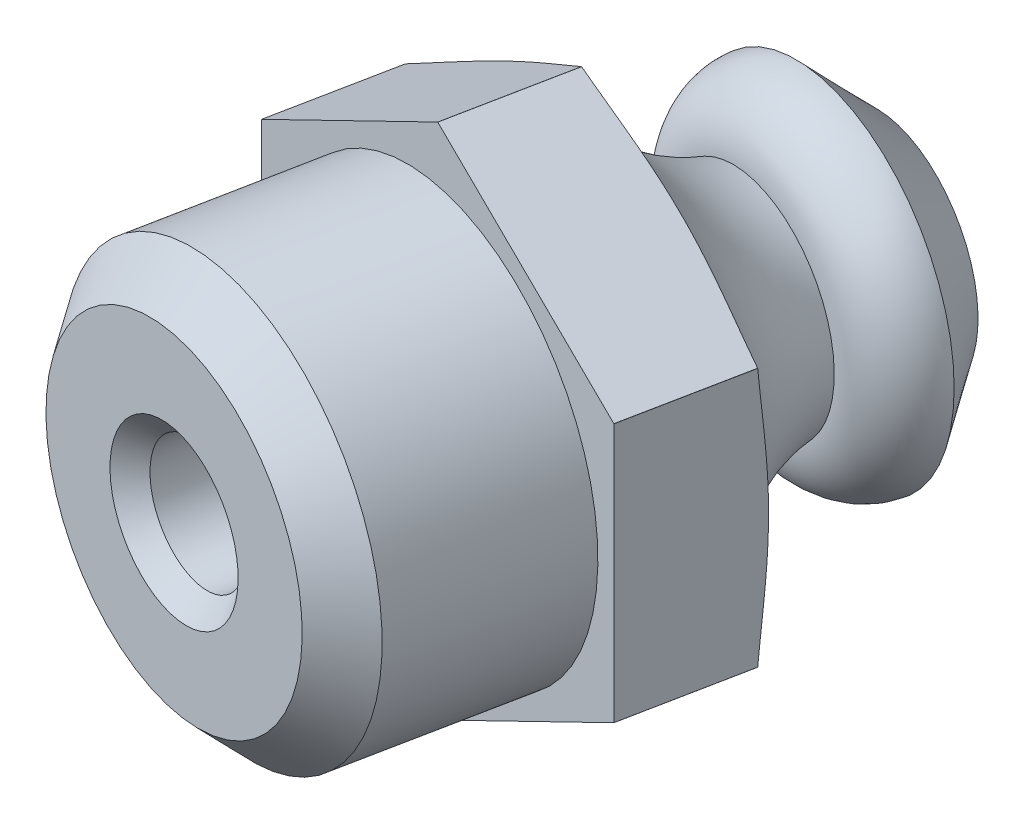
ISO-10303-21;
HEADER;
FILE_DESCRIPTION(('STEP AP214'),'2;1');
FILE_NAME('part.step','',(''),(''),'','','');
FILE_SCHEMA(('AUTOMOTIVE_DESIGN { 1 0 10303 214 1 1 1 1 }'));
ENDSEC;
DATA;
#1=APPLICATION_CONTEXT('core data for automotive mechanical design processes');
#2=APPLICATION_PROTOCOL_DEFINITION('international standard','automotive_design',2000,#1);
#3=PRODUCT_CONTEXT('',#1,'mechanical');
#4=PRODUCT('Part','Part','',(#3));
#5=PRODUCT_RELATED_PRODUCT_CATEGORY('part','',(#4));
#6=PRODUCT_DEFINITION_FORMATION('','',#4);
#7=PRODUCT_DEFINITION_CONTEXT('part definition',#1,'design');
#8=PRODUCT_DEFINITION('design','',#6,#7);
#9=PRODUCT_DEFINITION_SHAPE('','',#8);
#10=(LENGTH_UNIT() NAMED_UNIT(*) SI_UNIT(.MILLI.,.METRE.));
#11=(NAMED_UNIT(*) PLANE_ANGLE_UNIT() SI_UNIT($,.RADIAN.));
#12=(NAMED_UNIT(*) SI_UNIT($,.STERADIAN.) SOLID_ANGLE_UNIT());
#13=UNCERTAINTY_MEASURE_WITH_UNIT(LENGTH_MEASURE(1.E-05),#10,'distance_accuracy_value','');
#14=(GEOMETRIC_REPRESENTATION_CONTEXT(3) GLOBAL_UNCERTAINTY_ASSIGNED_CONTEXT((#13)) GLOBAL_UNIT_ASSIGNED_CONTEXT((#10,
#11,#12)) REPRESENTATION_CONTEXT('',''));
#15=CARTESIAN_POINT('',(0.,0.,0.));
#16=DIRECTION('',(0.,0.,1.));
#17=DIRECTION('',(1.,0.,0.));
#18=AXIS2_PLACEMENT_3D('',#15,#16,#17);
#19=CARTESIAN_POINT('',(-15.176286513132,5.,76.2963445312825));
#20=DIRECTION('',(0.195090322016136,0.,-0.980785280403229));
#21=DIRECTION('',(0.,1.,0.));
#22=AXIS2_PLACEMENT_3D('',#19,#20,#21);
#23=CONICAL_SURFACE('',#22,4.,0.785398163397446);
#24=CARTESIAN_POINT('',(-15.176286513132,5.,76.2963445312825));
#25=DIRECTION('',(-0.195090322016136,0.,0.980785280403229));
#26=DIRECTION('',(0.,1.,0.));
#27=AXIS2_PLACEMENT_3D('',#24,#25,#26);
#28=CIRCLE('',#27,4.);
#29=CARTESIAN_POINT('',(-15.176286513132,9.,76.2963445312825));
#30=VERTEX_POINT('',#29);
#31=EDGE_CURVE('E595',#30,#30,#28,.T.);
#32=ORIENTED_EDGE('',*,*,#31,.F.);
#33=EDGE_LOOP('',(#32));
#34=FACE_BOUND('',#33,.T.);
#35=CARTESIAN_POINT('',(-14.9811961911159,5.,75.3155592508793));
#36=DIRECTION('',(0.195090322016136,0.,-0.980785280403229));
#37=DIRECTION('',(0.,1.,0.));
#38=AXIS2_PLACEMENT_3D('',#35,#36,#37);
#39=CIRCLE('',#38,5.);
#40=CARTESIAN_POINT('',(-14.9811961911159,10.,75.3155592508793));
#41=VERTEX_POINT('',#40);
#42=EDGE_CURVE('E587',#41,#41,#39,.T.);
#43=ORIENTED_EDGE('',*,*,#42,.F.);
#44=EDGE_LOOP('',(#43));
#45=FACE_BOUND('',#44,.T.);
#46=ADVANCED_FACE('F17',(#34,#45),#23,.T.);
#47=CARTESIAN_POINT('',(-16.6474644337369,5.,76.0037090482583));
#48=DIRECTION('',(0.195090322016136,0.,-0.980785280403229));
#49=DIRECTION('',(0.,1.,0.));
#50=AXIS2_PLACEMENT_3D('',#47,#48,#49);
#51=PLANE('',#50);
#52=ORIENTED_EDGE('',*,*,#31,.T.);
#53=EDGE_LOOP('',(#52));
#54=FACE_BOUND('',#53,.T.);
#55=CARTESIAN_POINT('',(-15.1762865131321,5.,76.2963445312825));
#56=DIRECTION('',(0.195090322016136,0.,-0.980785280403229));
#57=DIRECTION('',(0.,1.,0.));
#58=AXIS2_PLACEMENT_3D('',#55,#56,#57);
#59=CIRCLE('',#58,1.99999999999998);
#60=CARTESIAN_POINT('',(-15.176286513132,6.99999999999998,76.2963445312825));
#61=VERTEX_POINT('',#60);
#62=EDGE_CURVE('E580',#61,#61,#59,.T.);
#63=ORIENTED_EDGE('',*,*,#62,.T.);
#64=EDGE_LOOP('',(#63));
#65=FACE_BOUND('',#64,.T.);
#66=ADVANCED_FACE('F606',(#54,#65),#51,.F.);
#67=CARTESIAN_POINT('',(-15.176286513132,5.,76.2963445312825));
#68=DIRECTION('',(-0.195090322016136,0.,0.980785280403229));
#69=DIRECTION('',(0.,-1.,0.));
#70=AXIS2_PLACEMENT_3D('',#67,#68,#69);
#71=CYLINDRICAL_SURFACE('',#70,5.);
#72=CARTESIAN_POINT('',(-14.1032897420433,5.,70.9020254890648));
#73=DIRECTION('',(-0.195090322016136,0.,0.980785280403229));
#74=DIRECTION('',(0.,-1.,0.));
#75=AXIS2_PLACEMENT_3D('',#72,#73,#74);
#76=CIRCLE('',#75,5.);
#77=CARTESIAN_POINT('',(-14.1032897420433,0.,70.9020254890648));
#78=VERTEX_POINT('',#77);
#79=EDGE_CURVE('E143',#78,#78,#76,.T.);
#80=ORIENTED_EDGE('',*,*,#79,.T.);
#81=EDGE_LOOP('',(#80));
#82=FACE_BOUND('',#81,.T.);
#83=ORIENTED_EDGE('',*,*,#42,.T.);
#84=EDGE_LOOP('',(#83));
#85=FACE_BOUND('',#84,.T.);
#86=ADVANCED_FACE('F614',(#82,#85),#71,.T.);
#87=CARTESIAN_POINT('',(-15.078741352124,5.,75.8059518910809));
#88=DIRECTION('',(-0.195090322016136,0.,0.980785280403229));
#89=DIRECTION('',(0.,-1.,0.));
#90=AXIS2_PLACEMENT_3D('',#87,#88,#89);
#91=CONICAL_SURFACE('',#90,1.5,0.78539816339745);
#92=CARTESIAN_POINT('',(-15.0787413521239,5.,75.8059518910809));
#93=DIRECTION('',(-0.195090322016136,0.,0.980785280403229));
#94=DIRECTION('',(0.,1.,0.));
#95=AXIS2_PLACEMENT_3D('',#92,#93,#94);
#96=CIRCLE('',#95,1.5);
#97=CARTESIAN_POINT('',(-15.078741352124,6.5,75.8059518910809));
#98=VERTEX_POINT('',#97);
#99=EDGE_CURVE('E136',#98,#98,#96,.T.);
#100=ORIENTED_EDGE('',*,*,#99,.F.);
#101=EDGE_LOOP('',(#100));
#102=FACE_BOUND('',#101,.T.);
#103=ORIENTED_EDGE('',*,*,#62,.F.);
#104=EDGE_LOOP('',(#103));
#105=FACE_BOUND('',#104,.T.);
#106=ADVANCED_FACE('F616',(#102,#105),#91,.F.);
#107=CARTESIAN_POINT('',(-19.0072161440594,5.,69.9265738789841));
#108=DIRECTION('',(0.195090322016136,0.,-0.980785280403229));
#109=DIRECTION('',(0.,1.,0.));
#110=AXIS2_PLACEMENT_3D('',#107,#108,#109);
#111=PLANE('',#110);
#112=ORIENTED_EDGE('',*,*,#79,.F.);
#113=EDGE_LOOP('',(#112));
#114=FACE_BOUND('',#113,.T.);
#115=DIRECTION('',(0.,-1.,0.));
#116=VECTOR('',#115,1.);
#117=CARTESIAN_POINT('',(-8.70897069982553,8.17372021451168,71.9750222601535));
#118=LINE('',#117,#116);
#119=CARTESIAN_POINT('',(-8.70897069982553,8.17372021451168,71.9750222601535));
#120=VERTEX_POINT('',#119);
#121=CARTESIAN_POINT('',(-8.70897069982553,1.82627978548834,71.9750222601535));
#122=VERTEX_POINT('',#121);
#123=EDGE_CURVE('E119',#120,#122,#118,.T.);
#124=ORIENTED_EDGE('',*,*,#123,.F.);
#125=CARTESIAN_POINT('',(-14.1032897420433,5.,70.9020254890648));
#126=DIRECTION('',(-0.195090322016136,0.,0.980785280403229));
#127=DIRECTION('',(0.849499061766574,0.499798458978219,0.168975869462794));
#128=AXIS2_PLACEMENT_3D('',#125,#126,#127);
#129=CIRCLE('',#128,6.35);
#130=CARTESIAN_POINT('',(-8.71041997654474,8.1762796135586,71.9747339810903));
#131=VERTEX_POINT('',#130);
#132=EDGE_CURVE('E107',#120,#131,#129,.T.);
#133=ORIENTED_EDGE('',*,*,#132,.T.);
#134=DIRECTION('',(0.849384968487041,-0.5,0.16895317489846));
#135=VECTOR('',#134,1.);
#136=CARTESIAN_POINT('',(-14.1018404653241,11.3499998280703,70.9023137681279));
#137=LINE('',#136,#135);
#138=CARTESIAN_POINT('',(-14.1018404653241,11.3499998280703,70.9023137681279));
#139=VERTEX_POINT('',#138);
#140=EDGE_CURVE('E118',#139,#131,#137,.T.);
#141=ORIENTED_EDGE('',*,*,#140,.F.);
#142=CARTESIAN_POINT('',(-14.1032897420433,5.,70.9020254890648));
#143=DIRECTION('',(-0.195090322016136,0.,0.980785280403229));
#144=DIRECTION('',(0.000228232554195488,0.999999972924448,4.53982776680031E-05));
#145=AXIS2_PLACEMENT_3D('',#142,#143,#144);
#146=CIRCLE('',#145,6.35);
#147=CARTESIAN_POINT('',(-14.1047390187625,11.3499998280703,70.9017372100015));
#148=VERTEX_POINT('',#147);
#149=EDGE_CURVE('E153',#139,#148,#146,.T.);
#150=ORIENTED_EDGE('',*,*,#149,.T.);
#151=DIRECTION('',(0.849384968487041,0.5,0.16895317489846));
#152=VECTOR('',#151,1.);
#153=CARTESIAN_POINT('',(-19.4961595075418,8.17627961355863,69.8293169970393));
#154=LINE('',#153,#152);
#155=CARTESIAN_POINT('',(-19.4961595075418,8.17627961355861,69.8293169970392));
#156=VERTEX_POINT('',#155);
#157=EDGE_CURVE('E159',#156,#148,#154,.T.);
#158=ORIENTED_EDGE('',*,*,#157,.F.);
#159=CARTESIAN_POINT('',(-14.1032897420433,5.,70.9020254890648));
#160=DIRECTION('',(-0.195090322016136,0.,0.980785280403229));
#161=DIRECTION('',(-0.849270829212369,0.500201513946237,-0.168930471185124));
#162=AXIS2_PLACEMENT_3D('',#159,#160,#161);
#163=CIRCLE('',#162,6.35);
#164=CARTESIAN_POINT('',(-19.4976087842611,8.17372021451168,69.829028717976));
#165=VERTEX_POINT('',#164);
#166=EDGE_CURVE('E164',#156,#165,#163,.T.);
#167=ORIENTED_EDGE('',*,*,#166,.T.);
#168=DIRECTION('',(0.,1.,0.));
#169=VECTOR('',#168,1.);
#170=CARTESIAN_POINT('',(-19.4976087842611,1.82627978548835,69.829028717976));
#171=LINE('',#170,#169);
#172=CARTESIAN_POINT('',(-19.4976087842611,1.82627978548835,69.829028717976));
#173=VERTEX_POINT('',#172);
#174=EDGE_CURVE('E170',#173,#165,#171,.T.);
#175=ORIENTED_EDGE('',*,*,#174,.F.);
#176=CARTESIAN_POINT('',(-14.1032897420433,5.,70.9020254890648));
#177=DIRECTION('',(-0.195090322016136,0.,0.980785280403229));
#178=DIRECTION('',(-0.849499061766581,-0.499798458978207,-0.168975869462796));
#179=AXIS2_PLACEMENT_3D('',#176,#177,#178);
#180=CIRCLE('',#179,6.35);
#181=CARTESIAN_POINT('',(-19.4961595075418,1.82372038644142,69.8293169970392));
#182=VERTEX_POINT('',#181);
#183=EDGE_CURVE('E175',#173,#182,#180,.T.);
#184=ORIENTED_EDGE('',*,*,#183,.T.);
#185=DIRECTION('',(-0.849384968487041,0.5,-0.168953174898458));
#186=VECTOR('',#185,1.);
#187=CARTESIAN_POINT('',(-14.1047390187625,-1.34999982807024,70.9017372100016));
#188=LINE('',#187,#186);
#189=CARTESIAN_POINT('',(-14.1047390187625,-1.34999982807024,70.9017372100015));
#190=VERTEX_POINT('',#189);
#191=EDGE_CURVE('E181',#190,#182,#188,.T.);
#192=ORIENTED_EDGE('',*,*,#191,.F.);
#193=CARTESIAN_POINT('',(-14.1032897420433,5.,70.9020254890648));
#194=DIRECTION('',(-0.195090322016136,0.,0.980785280403229));
#195=DIRECTION('',(-0.000228232554213543,-0.999999972924448,-4.53982776715945E-05));
#196=AXIS2_PLACEMENT_3D('',#193,#194,#195);
#197=CIRCLE('',#196,6.35);
#198=CARTESIAN_POINT('',(-14.1018404653241,-1.34999982807024,70.9023137681279));
#199=VERTEX_POINT('',#198);
#200=EDGE_CURVE('E186',#190,#199,#197,.T.);
#201=ORIENTED_EDGE('',*,*,#200,.T.);
#202=DIRECTION('',(-0.849384968487041,-0.499999999999999,-0.168953174898458));
#203=VECTOR('',#202,1.);
#204=CARTESIAN_POINT('',(-8.71041997654473,1.82372038644142,71.9747339810903));
#205=LINE('',#204,#203);
#206=CARTESIAN_POINT('',(-8.71041997654474,1.82372038644142,71.9747339810903));
#207=VERTEX_POINT('',#206);
#208=EDGE_CURVE('E192',#207,#199,#205,.T.);
#209=ORIENTED_EDGE('',*,*,#208,.F.);
#210=CARTESIAN_POINT('',(-14.1032897420433,5.,70.9020254890648));
#211=DIRECTION('',(-0.195090322016136,0.,0.980785280403229));
#212=DIRECTION('',(0.849270829212369,-0.500201513946236,0.168930471185125));
#213=AXIS2_PLACEMENT_3D('',#210,#211,#212);
#214=CIRCLE('',#213,6.35);
#215=EDGE_CURVE('E134',#207,#122,#214,.T.);
#216=ORIENTED_EDGE('',*,*,#215,.T.);
#217=EDGE_LOOP('',(#124,#133,#141,#150,#158,#167,#175,#184,#192,#201,#209,#216));
#218=FACE_BOUND('',#217,.T.);
#219=ADVANCED_FACE('F132',(#114,#218),#111,.F.);
#220=CARTESIAN_POINT('',(-15.176286513132,5.,76.2963445312825));
#221=DIRECTION('',(-0.195090322016136,0.,0.980785280403229));
#222=DIRECTION('',(0.,-1.,0.));
#223=AXIS2_PLACEMENT_3D('',#220,#221,#222);
#224=CYLINDRICAL_SURFACE('',#223,1.5);
#225=CARTESIAN_POINT('',(-12.24993168289,5.,61.5845653252341));
#226=DIRECTION('',(-0.195090322016136,0.,0.980785280403229));
#227=DIRECTION('',(0.,-1.,0.));
#228=AXIS2_PLACEMENT_3D('',#225,#226,#227);
#229=CIRCLE('',#228,1.5);
#230=CARTESIAN_POINT('',(-12.24993168289,3.5,61.5845653252341));
#231=VERTEX_POINT('',#230);
#232=EDGE_CURVE('E201',#231,#231,#229,.T.);
#233=ORIENTED_EDGE('',*,*,#232,.F.);
#234=EDGE_LOOP('',(#233));
#235=FACE_BOUND('',#234,.T.);
#236=ORIENTED_EDGE('',*,*,#99,.T.);
#237=EDGE_LOOP('',(#236));
#238=FACE_BOUND('',#237,.T.);
#239=ADVANCED_FACE('F225',(#235,#238),#224,.F.);
#240=CARTESIAN_POINT('',(-5.68507070857543,8.17542648054296,56.7728504139034));
#241=DIRECTION('',(0.980785280403229,0.,0.195090322016136));
#242=DIRECTION('',(0.,1.,0.));
#243=AXIS2_PLACEMENT_3D('',#240,#241,#242);
#244=PLANE('',#243);
#245=ORIENTED_EDGE('',*,*,#123,.T.);
#246=DIRECTION('',(0.195090322016136,0.,-0.980785280403229));
#247=VECTOR('',#246,1.);
#248=CARTESIAN_POINT('',(-8.70897069982554,1.82627978548834,71.9750222601535));
#249=LINE('',#248,#247);
#250=CARTESIAN_POINT('',(-8.12369973377713,1.82627978548835,69.0326664189438));
#251=VERTEX_POINT('',#250);
#252=EDGE_CURVE('E207',#122,#251,#249,.T.);
#253=ORIENTED_EDGE('',*,*,#252,.T.);
#254=CARTESIAN_POINT('',(-8.12369973377713,1.82627978548834,69.0326664189437));
#255=CARTESIAN_POINT('',(-8.115156579806,2.35434082320489,68.9897170835974));
#256=CARTESIAN_POINT('',(-8.10357706220344,2.88013167652892,68.9315029174543));
#257=CARTESIAN_POINT('',(-8.0854995750906,3.93737396594339,68.8406212525735));
#258=CARTESIAN_POINT('',(-8.0793829680692,4.46832011497641,68.809870992537));
#259=CARTESIAN_POINT('',(-8.0793829680692,5.53167988502361,68.809870992537));
#260=CARTESIAN_POINT('',(-8.0854995750906,6.06262603405663,68.8406212525735));
#261=CARTESIAN_POINT('',(-8.10357706220344,7.11986832347109,68.9315029174543));
#262=CARTESIAN_POINT('',(-8.115156579806,7.64565917679513,68.9897170835974));
#263=CARTESIAN_POINT('',(-8.12369973377713,8.17372021451168,69.0326664189437));
#264=B_SPLINE_CURVE_WITH_KNOTS('',3,(#254,#255,#256,#257,#258,#259,#260,#261,#262,#263),
.UNSPECIFIED.,.F.,.F.,(4,2,2,2,4),(0.,1.58686010725584,3.17372021451167,4.7605803217675,
6.34744042902333),.UNSPECIFIED.);
#265=CARTESIAN_POINT('',(-8.12369973377713,8.17372021451167,69.0326664189438));
#266=VERTEX_POINT('',#265);
#267=EDGE_CURVE('E126',#251,#266,#264,.T.);
#268=ORIENTED_EDGE('',*,*,#267,.T.);
#269=DIRECTION('',(-0.195090322016136,0.,0.980785280403229));
#270=VECTOR('',#269,1.);
#271=CARTESIAN_POINT('',(-8.12369973377713,8.17372021451168,69.0326664189438));
#272=LINE('',#271,#270);
#273=EDGE_CURVE('E111',#266,#120,#272,.T.);
#274=ORIENTED_EDGE('',*,*,#273,.T.);
#275=EDGE_LOOP('',(#245,#253,#268,#274));
#276=FACE_BOUND('',#275,.T.);
#277=ADVANCED_FACE('F124',(#276),#244,.T.);
#278=CARTESIAN_POINT('',(-15.176286513132,5.,76.2963445312825));
#279=DIRECTION('',(-0.195090322016136,0.,0.980785280403229));
#280=DIRECTION('',(0.,-1.,0.));
#281=AXIS2_PLACEMENT_3D('',#278,#279,#280);
#282=CYLINDRICAL_SURFACE('',#281,6.35);
#283=ORIENTED_EDGE('',*,*,#273,.F.);
#284=CARTESIAN_POINT('',(-13.5180187759948,5.,67.959669647855));
#285=DIRECTION('',(-0.195090322016136,0.,0.980785280403229));
#286=DIRECTION('',(0.849499061766575,0.499798458978219,0.168975869462795));
#287=AXIS2_PLACEMENT_3D('',#284,#285,#286);
#288=CIRCLE('',#287,6.34999999999995);
#289=CARTESIAN_POINT('',(-8.12514901049634,8.17627961355862,69.0323781398806));
#290=VERTEX_POINT('',#289);
#291=EDGE_CURVE('E129',#266,#290,#288,.T.);
#292=ORIENTED_EDGE('',*,*,#291,.T.);
#293=DIRECTION('',(0.195090322016136,0.,-0.980785280403229));
#294=VECTOR('',#293,1.);
#295=CARTESIAN_POINT('',(-8.71041997654476,8.1762796135586,71.9747339810903));
#296=LINE('',#295,#294);
#297=EDGE_CURVE('E113',#131,#290,#296,.T.);
#298=ORIENTED_EDGE('',*,*,#297,.F.);
#299=ORIENTED_EDGE('',*,*,#132,.F.);
#300=EDGE_LOOP('',(#283,#292,#298,#299));
#301=FACE_BOUND('',#300,.T.);
#302=ADVANCED_FACE('F109',(#301),#282,.T.);
#303=CARTESIAN_POINT('',(-11.0793897507932,11.3508529610859,55.6998536428147));
#304=DIRECTION('',(0.490392640201614,0.866025403784439,0.0975451610080677));
#305=DIRECTION('',(-0.84938496848704,0.5,-0.16895317489846));
#306=AXIS2_PLACEMENT_3D('',#303,#304,#305);
#307=PLANE('',#306);
#308=ORIENTED_EDGE('',*,*,#140,.T.);
#309=ORIENTED_EDGE('',*,*,#297,.T.);
#310=CARTESIAN_POINT('',(-8.12514901049634,8.1762796135586,69.0323781398806));
#311=CARTESIAN_POINT('',(-8.56513296440532,8.44031013241688,68.9002112156718));
#312=CARTESIAN_POINT('',(-9.00015229418417,8.7032055590789,68.753163015527));
#313=CARTESIAN_POINT('',(-9.88008051574879,9.23182670378613,68.4836569092127));
#314=CARTESIAN_POINT('',(-10.3249415867921,9.49729977830263,68.363201611597));
#315=CARTESIAN_POINT('',(-11.228143391564,10.0289796633262,68.1835436023882));
#316=CARTESIAN_POINT('',(-11.6852376766502,10.2944527378427,68.1245888248455));
#317=CARTESIAN_POINT('',(-12.6013208724405,10.82307388255,68.0368460482928));
#318=CARTESIAN_POINT('',(-13.0594992374245,11.085969309212,68.0062261804342));
#319=CARTESIAN_POINT('',(-13.5165694992757,11.3499998280703,67.9599579269182));
#320=B_SPLINE_CURVE_WITH_KNOTS('',3,(#310,#311,#312,#313,#314,#315,#316,#317,#318,#319),
.UNSPECIFIED.,.F.,.F.,(4,2,2,2,4),(0.,1.58686010725587,3.1737202145117,4.76058032176754,
6.34744042902337),.UNSPECIFIED.);
#321=CARTESIAN_POINT('',(-13.5165694992757,11.3499998280703,67.9599579269183));
#322=VERTEX_POINT('',#321);
#323=EDGE_CURVE('E256',#290,#322,#320,.T.);
#324=ORIENTED_EDGE('',*,*,#323,.T.);
#325=DIRECTION('',(-0.195090322016136,0.,0.980785280403229));
#326=VECTOR('',#325,1.);
#327=CARTESIAN_POINT('',(-13.5165694992758,11.3499998280703,67.9599579269183));
#328=LINE('',#327,#326);
#329=EDGE_CURVE('E246',#322,#139,#328,.T.);
#330=ORIENTED_EDGE('',*,*,#329,.T.);
#331=EDGE_LOOP('',(#308,#309,#324,#330));
#332=FACE_BOUND('',#331,.T.);
#333=ADVANCED_FACE('F229',(#332),#307,.T.);
#334=DIRECTION('',(0.195090322016135,0.,-0.980785280403229));
#335=VECTOR('',#334,1.);
#336=CARTESIAN_POINT('',(-14.1047390187624,11.3499998280703,70.9017372100015));
#337=LINE('',#336,#335);
#338=CARTESIAN_POINT('',(-13.519468052714,11.3499998280703,67.9593813687918));
#339=VERTEX_POINT('',#338);
#340=EDGE_CURVE('E255',#148,#339,#337,.T.);
#341=ORIENTED_EDGE('',*,*,#340,.F.);
#342=ORIENTED_EDGE('',*,*,#149,.F.);
#343=ORIENTED_EDGE('',*,*,#329,.F.);
#344=CARTESIAN_POINT('',(-13.5180187759948,5.,67.959669647855));
#345=DIRECTION('',(-0.195090322016136,0.,0.980785280403229));
#346=DIRECTION('',(0.000228232554197788,0.999999972924448,4.53982776684606E-05));
#347=AXIS2_PLACEMENT_3D('',#344,#345,#346);
#348=CIRCLE('',#347,6.35);
#349=EDGE_CURVE('E262',#322,#339,#348,.T.);
#350=ORIENTED_EDGE('',*,*,#349,.T.);
#351=EDGE_LOOP('',(#341,#342,#343,#350));
#352=FACE_BOUND('',#351,.T.);
#353=ADVANCED_FACE('F231',(#352),#282,.T.);
#354=CARTESIAN_POINT('',(-16.4737087930109,8.17542648054296,54.6268568717259));
#355=DIRECTION('',(-0.490392640201614,0.866025403784439,-0.0975451610080678));
#356=DIRECTION('',(-0.849384968487041,-0.499999999999999,-0.16895317489846));
#357=AXIS2_PLACEMENT_3D('',#354,#355,#356);
#358=PLANE('',#357);
#359=ORIENTED_EDGE('',*,*,#157,.T.);
#360=ORIENTED_EDGE('',*,*,#340,.T.);
#361=CARTESIAN_POINT('',(-13.5194680527141,11.3499998280702,67.9593813687918));
#362=CARTESIAN_POINT('',(-13.959452006623,11.085969309212,67.8272144445831));
#363=CARTESIAN_POINT('',(-14.3944713364019,10.82307388255,67.6801662444383));
#364=CARTESIAN_POINT('',(-15.2743995579665,10.2944527378427,67.410660138124));
#365=CARTESIAN_POINT('',(-15.7192606290098,10.0289796633262,67.2902048405083));
#366=CARTESIAN_POINT('',(-16.6224624337818,9.49729977830262,67.1105468312995));
#367=CARTESIAN_POINT('',(-17.0795567188679,9.23182670378612,67.0515920537567));
#368=CARTESIAN_POINT('',(-17.9956399146582,8.70320555907889,66.963849277204));
#369=CARTESIAN_POINT('',(-18.4538182796422,8.44031013241687,66.9332294093455));
#370=CARTESIAN_POINT('',(-18.9108885414934,8.1762796135586,66.8869611558295));
#371=B_SPLINE_CURVE_WITH_KNOTS('',3,(#361,#362,#363,#364,#365,#366,#367,#368,#369,#370),
.UNSPECIFIED.,.F.,.F.,(4,2,2,2,4),(0.,1.58686010725582,3.17372021451165,4.76058032176747,
6.34744042902329),.UNSPECIFIED.);
#372=CARTESIAN_POINT('',(-18.9108885414935,8.17627961355858,66.8869611558295));
#373=VERTEX_POINT('',#372);
#374=EDGE_CURVE('E268',#339,#373,#371,.T.);
#375=ORIENTED_EDGE('',*,*,#374,.T.);
#376=DIRECTION('',(-0.195090322016136,0.,0.980785280403229));
#377=VECTOR('',#376,1.);
#378=CARTESIAN_POINT('',(-18.9108885414934,8.17627961355861,66.8869611558295));
#379=LINE('',#378,#377);
#380=EDGE_CURVE('E279',#373,#156,#379,.T.);
#381=ORIENTED_EDGE('',*,*,#380,.T.);
#382=EDGE_LOOP('',(#359,#360,#375,#381));
#383=FACE_BOUND('',#382,.T.);
#384=ADVANCED_FACE('F236',(#383),#358,.T.);
#385=DIRECTION('',(0.195090322016135,0.,-0.980785280403229));
#386=VECTOR('',#385,1.);
#387=CARTESIAN_POINT('',(-19.497608784261,8.17372021451169,69.829028717976));
#388=LINE('',#387,#386);
#389=CARTESIAN_POINT('',(-18.9123378182126,8.17372021451174,66.8866728767663));
#390=VERTEX_POINT('',#389);
#391=EDGE_CURVE('E287',#165,#390,#388,.T.);
#392=ORIENTED_EDGE('',*,*,#391,.F.);
#393=ORIENTED_EDGE('',*,*,#166,.F.);
#394=ORIENTED_EDGE('',*,*,#380,.F.);
#395=CARTESIAN_POINT('',(-13.5180187759948,5.,67.959669647855));
#396=DIRECTION('',(-0.195090322016136,0.,0.980785280403229));
#397=DIRECTION('',(-0.849270829212373,0.50020151394623,-0.168930471185125));
#398=AXIS2_PLACEMENT_3D('',#395,#396,#397);
#399=CIRCLE('',#398,6.35000000000006);
#400=EDGE_CURVE('E293',#373,#390,#399,.T.);
#401=ORIENTED_EDGE('',*,*,#400,.T.);
#402=EDGE_LOOP('',(#392,#393,#394,#401));
#403=FACE_BOUND('',#402,.T.);
#404=ADVANCED_FACE('F322',(#403),#282,.T.);
#405=CARTESIAN_POINT('',(-16.4737087930109,1.82457351945706,54.6268568717259));
#406=DIRECTION('',(-0.980785280403229,0.,-0.195090322016136));
#407=DIRECTION('',(0.,-1.,0.));
#408=AXIS2_PLACEMENT_3D('',#405,#406,#407);
#409=PLANE('',#408);
#410=ORIENTED_EDGE('',*,*,#174,.T.);
#411=ORIENTED_EDGE('',*,*,#391,.T.);
#412=CARTESIAN_POINT('',(-18.9123378182126,8.17372021451168,66.8866728767663));
#413=CARTESIAN_POINT('',(-18.9037946642415,7.64565917679514,66.8437235414199));
#414=CARTESIAN_POINT('',(-18.8922151466389,7.11986832347111,66.7855093752768));
#415=CARTESIAN_POINT('',(-18.8741376595261,6.06262603405664,66.694627710396));
#416=CARTESIAN_POINT('',(-18.8680210525047,5.53167988502362,66.6638774503595));
#417=CARTESIAN_POINT('',(-18.8680210525047,4.46832011497642,66.6638774503595));
#418=CARTESIAN_POINT('',(-18.8741376595261,3.9373739659434,66.694627710396));
#419=CARTESIAN_POINT('',(-18.8922151466389,2.88013167652892,66.7855093752768));
#420=CARTESIAN_POINT('',(-18.9037946642415,2.35434082320489,66.8437235414199));
#421=CARTESIAN_POINT('',(-18.9123378182126,1.82627978548834,66.8866728767663));
#422=B_SPLINE_CURVE_WITH_KNOTS('',3,(#412,#413,#414,#415,#416,#417,#418,#419,#420,#421),
.UNSPECIFIED.,.F.,.F.,(4,2,2,2,4),(0.,1.58686010725584,3.17372021451167,4.76058032176751,
6.34744042902334),.UNSPECIFIED.);
#423=CARTESIAN_POINT('',(-18.9123378182126,1.82627978548829,66.8866728767663));
#424=VERTEX_POINT('',#423);
#425=EDGE_CURVE('E299',#390,#424,#422,.T.);
#426=ORIENTED_EDGE('',*,*,#425,.T.);
#427=DIRECTION('',(-0.195090322016135,0.,0.980785280403229));
#428=VECTOR('',#427,1.);
#429=CARTESIAN_POINT('',(-18.9123378182126,1.82627978548835,66.8866728767663));
#430=LINE('',#429,#428);
#431=EDGE_CURVE('E310',#424,#173,#430,.T.);
#432=ORIENTED_EDGE('',*,*,#431,.T.);
#433=EDGE_LOOP('',(#410,#411,#426,#432));
#434=FACE_BOUND('',#433,.T.);
#435=ADVANCED_FACE('F312',(#434),#409,.T.);
#436=DIRECTION('',(0.195090322016136,0.,-0.980785280403229));
#437=VECTOR('',#436,1.);
#438=CARTESIAN_POINT('',(-19.4961595075418,1.82372038644142,69.8293169970392));
#439=LINE('',#438,#437);
#440=CARTESIAN_POINT('',(-18.9108885414935,1.82372038644141,66.8869611558295));
#441=VERTEX_POINT('',#440);
#442=EDGE_CURVE('E436',#182,#441,#439,.T.);
#443=ORIENTED_EDGE('',*,*,#442,.F.);
#444=ORIENTED_EDGE('',*,*,#183,.F.);
#445=ORIENTED_EDGE('',*,*,#431,.F.);
#446=CARTESIAN_POINT('',(-13.5180187759948,5.,67.959669647855));
#447=DIRECTION('',(-0.195090322016136,0.,0.980785280403229));
#448=DIRECTION('',(-0.849499061766574,-0.49979845897822,-0.168975869462794));
#449=AXIS2_PLACEMENT_3D('',#446,#447,#448);
#450=CIRCLE('',#449,6.35000000000006);
#451=EDGE_CURVE('E430',#424,#441,#450,.T.);
#452=ORIENTED_EDGE('',*,*,#451,.T.);
#453=EDGE_LOOP('',(#443,#444,#445,#452));
#454=FACE_BOUND('',#453,.T.);
#455=ADVANCED_FACE('F321',(#454),#282,.T.);
#456=CARTESIAN_POINT('',(-11.0793897507932,-1.35085296108587,55.6998536428147));
#457=DIRECTION('',(-0.490392640201614,-0.866025403784439,-0.0975451610080678));
#458=DIRECTION('',(0.84938496848704,-0.5,0.16895317489846));
#459=AXIS2_PLACEMENT_3D('',#456,#457,#458);
#460=PLANE('',#459);
#461=ORIENTED_EDGE('',*,*,#191,.T.);
#462=ORIENTED_EDGE('',*,*,#442,.T.);
#463=CARTESIAN_POINT('',(-18.9108885414934,1.8237203864414,66.8869611558295));
#464=CARTESIAN_POINT('',(-18.4538182796422,1.55968986758313,66.9332294093455));
#465=CARTESIAN_POINT('',(-17.9956399146582,1.29679444092111,66.963849277204));
#466=CARTESIAN_POINT('',(-17.0795567188679,0.768173296213887,67.0515920537567));
#467=CARTESIAN_POINT('',(-16.6224624337818,0.502700221697385,67.1105468312995));
#468=CARTESIAN_POINT('',(-15.7192606290099,-0.0289796633262066,67.2902048405083));
#469=CARTESIAN_POINT('',(-15.2743995579665,-0.294452737842715,67.410660138124));
#470=CARTESIAN_POINT('',(-14.3944713364019,-0.823073882549943,67.6801662444383));
#471=CARTESIAN_POINT('',(-13.9594520066231,-1.08596930921195,67.827214444583));
#472=CARTESIAN_POINT('',(-13.5194680527141,-1.34999982807023,67.9593813687918));
#473=B_SPLINE_CURVE_WITH_KNOTS('',3,(#463,#464,#465,#466,#467,#468,#469,#470,#471,#472),
.UNSPECIFIED.,.F.,.F.,(4,2,2,2,4),(0.,1.58686010725582,3.17372021451163,4.76058032176745,
6.34744042902327),.UNSPECIFIED.);
#474=CARTESIAN_POINT('',(-13.5194680527141,-1.34999982807023,67.9593813687918));
#475=VERTEX_POINT('',#474);
#476=EDGE_CURVE('E349',#441,#475,#473,.T.);
#477=ORIENTED_EDGE('',*,*,#476,.T.);
#478=DIRECTION('',(-0.195090322016135,0.,0.980785280403229));
#479=VECTOR('',#478,1.);
#480=CARTESIAN_POINT('',(-13.519468052714,-1.34999982807023,67.9593813687918));
#481=LINE('',#480,#479);
#482=EDGE_CURVE('E339',#475,#190,#481,.T.);
#483=ORIENTED_EDGE('',*,*,#482,.T.);
#484=EDGE_LOOP('',(#461,#462,#477,#483));
#485=FACE_BOUND('',#484,.T.);
#486=ADVANCED_FACE('F323',(#485),#460,.T.);
#487=CARTESIAN_POINT('',(-13.5180187759948,5.,67.959669647855));
#488=DIRECTION('',(-0.195090322016136,0.,0.980785280403229));
#489=DIRECTION('',(-0.000228232554209518,-0.999999972924448,-4.53982776707939E-05));
#490=AXIS2_PLACEMENT_3D('',#487,#488,#489);
#491=CIRCLE('',#490,6.35);
#492=CARTESIAN_POINT('',(-13.5165694992757,-1.34999982807024,67.9599579269182));
#493=VERTEX_POINT('',#492);
#494=EDGE_CURVE('E348',#475,#493,#491,.T.);
#495=ORIENTED_EDGE('',*,*,#494,.T.);
#496=DIRECTION('',(0.195090322016136,0.,-0.980785280403229));
#497=VECTOR('',#496,1.);
#498=CARTESIAN_POINT('',(-14.1018404653241,-1.34999982807024,70.9023137681279));
#499=LINE('',#498,#497);
#500=EDGE_CURVE('E354',#199,#493,#499,.T.);
#501=ORIENTED_EDGE('',*,*,#500,.F.);
#502=ORIENTED_EDGE('',*,*,#200,.F.);
#503=ORIENTED_EDGE('',*,*,#482,.F.);
#504=EDGE_LOOP('',(#495,#501,#502,#503));
#505=FACE_BOUND('',#504,.T.);
#506=ADVANCED_FACE('F327',(#505),#282,.T.);
#507=CARTESIAN_POINT('',(-5.68507070857543,1.82457351945705,56.7728504139034));
#508=DIRECTION('',(0.490392640201614,-0.866025403784439,0.0975451610080678));
#509=DIRECTION('',(0.849384968487041,0.499999999999999,0.16895317489846));
#510=AXIS2_PLACEMENT_3D('',#507,#508,#509);
#511=PLANE('',#510);
#512=ORIENTED_EDGE('',*,*,#208,.T.);
#513=ORIENTED_EDGE('',*,*,#500,.T.);
#514=CARTESIAN_POINT('',(-13.5165694992757,-1.34999982807026,67.9599579269182));
#515=CARTESIAN_POINT('',(-13.0594992374245,-1.08596930921198,68.0062261804342));
#516=CARTESIAN_POINT('',(-12.6013208724405,-0.823073882549966,68.0368460482928));
#517=CARTESIAN_POINT('',(-11.6852376766502,-0.294452737842733,68.1245888248455));
#518=CARTESIAN_POINT('',(-11.2281433915641,-0.0289796633262255,68.1835436023882));
#519=CARTESIAN_POINT('',(-10.3249415867921,0.502700221697372,68.363201611597));
#520=CARTESIAN_POINT('',(-9.8800805157488,0.76817329621388,68.4836569092127));
#521=CARTESIAN_POINT('',(-9.00015229418417,1.29679444092111,68.753163015527));
#522=CARTESIAN_POINT('',(-8.56513296440533,1.55968986758313,68.9002112156718));
#523=CARTESIAN_POINT('',(-8.12514901049635,1.8237203864414,69.0323781398805));
#524=B_SPLINE_CURVE_WITH_KNOTS('',3,(#514,#515,#516,#517,#518,#519,#520,#521,#522,#523),
.UNSPECIFIED.,.F.,.F.,(4,2,2,2,4),(0.,1.58686010725583,3.17372021451167,4.7605803217675,
6.34744042902333),.UNSPECIFIED.);
#525=CARTESIAN_POINT('',(-8.12514901049635,1.8237203864414,69.0323781398806));
#526=VERTEX_POINT('',#525);
#527=EDGE_CURVE('E37',#493,#526,#524,.T.);
#528=ORIENTED_EDGE('',*,*,#527,.T.);
#529=DIRECTION('',(-0.195090322016136,0.,0.980785280403229));
#530=VECTOR('',#529,1.);
#531=CARTESIAN_POINT('',(-8.12514901049634,1.82372038644142,69.0323781398806));
#532=LINE('',#531,#530);
#533=EDGE_CURVE('E369',#526,#207,#532,.T.);
#534=ORIENTED_EDGE('',*,*,#533,.T.);
#535=EDGE_LOOP('',(#512,#513,#528,#534));
#536=FACE_BOUND('',#535,.T.);
#537=ADVANCED_FACE('F329',(#536),#511,.T.);
#538=ORIENTED_EDGE('',*,*,#252,.F.);
#539=ORIENTED_EDGE('',*,*,#215,.F.);
#540=ORIENTED_EDGE('',*,*,#533,.F.);
#541=CARTESIAN_POINT('',(-13.5180187759948,5.,67.959669647855));
#542=DIRECTION('',(-0.195090322016136,0.,0.980785280403229));
#543=DIRECTION('',(0.849270829212368,-0.500201513946239,0.168930471185124));
#544=AXIS2_PLACEMENT_3D('',#541,#542,#543);
#545=CIRCLE('',#544,6.34999999999994);
#546=EDGE_CURVE('E33',#526,#251,#545,.T.);
#547=ORIENTED_EDGE('',*,*,#546,.T.);
#548=EDGE_LOOP('',(#538,#539,#540,#547));
#549=FACE_BOUND('',#548,.T.);
#550=ADVANCED_FACE('F230',(#549),#282,.T.);
#551=CARTESIAN_POINT('',(-14.8490126759586,5.,61.0675759718913));
#552=DIRECTION('',(-0.195090322016136,0.,0.980785280403229));
#553=DIRECTION('',(0.,-1.,0.));
#554=AXIS2_PLACEMENT_3D('',#551,#552,#553);
#555=PLANE('',#554);
#556=CARTESIAN_POINT('',(-12.24993168289,5.,61.5845653252341));
#557=DIRECTION('',(-0.195090322016136,0.,0.980785280403229));
#558=DIRECTION('',(0.,-1.,0.));
#559=AXIS2_PLACEMENT_3D('',#556,#557,#558);
#560=CIRCLE('',#559,2.65);
#561=CARTESIAN_POINT('',(-12.24993168289,2.35,61.5845653252341));
#562=VERTEX_POINT('',#561);
#563=EDGE_CURVE('E381',#562,#562,#560,.T.);
#564=ORIENTED_EDGE('',*,*,#563,.F.);
#565=EDGE_LOOP('',(#564));
#566=FACE_BOUND('',#565,.T.);
#567=ORIENTED_EDGE('',*,*,#232,.T.);
#568=EDGE_LOOP('',(#567));
#569=FACE_BOUND('',#568,.T.);
#570=ADVANCED_FACE('F402',(#566,#569),#555,.F.);
#571=CARTESIAN_POINT('',(-12.6412886393964,5.,63.5520496081967));
#572=DIRECTION('',(-0.195090322016136,0.,0.980785280403229));
#573=DIRECTION('',(0.,-1.,0.));
#574=AXIS2_PLACEMENT_3D('',#571,#572,#573);
#575=TOROIDAL_SURFACE('',#574,7.09564769570836,4.55541003999998);
#576=ORIENTED_EDGE('',*,*,#349,.F.);
#577=ORIENTED_EDGE('',*,*,#323,.F.);
#578=ORIENTED_EDGE('',*,*,#291,.F.);
#579=ORIENTED_EDGE('',*,*,#267,.F.);
#580=ORIENTED_EDGE('',*,*,#546,.F.);
#581=ORIENTED_EDGE('',*,*,#527,.F.);
#582=ORIENTED_EDGE('',*,*,#494,.F.);
#583=ORIENTED_EDGE('',*,*,#476,.F.);
#584=ORIENTED_EDGE('',*,*,#451,.F.);
#585=ORIENTED_EDGE('',*,*,#425,.F.);
#586=ORIENTED_EDGE('',*,*,#400,.F.);
#587=ORIENTED_EDGE('',*,*,#374,.F.);
#588=EDGE_LOOP('',(#576,#577,#578,#579,#580,#581,#582,#583,#584,#585,#586,#587));
#589=FACE_BOUND('',#588,.T.);
#590=CARTESIAN_POINT('',(-12.8352026489384,5.,64.5269211664437));
#591=DIRECTION('',(-0.195090322016136,0.,0.980785280403229));
#592=DIRECTION('',(0.,-1.,0.));
#593=AXIS2_PLACEMENT_3D('',#590,#591,#592);
#594=CIRCLE('',#593,2.65);
#595=CARTESIAN_POINT('',(-12.8352026489384,2.35,64.5269211664437));
#596=VERTEX_POINT('',#595);
#597=EDGE_CURVE('E26',#596,#596,#594,.T.);
#598=ORIENTED_EDGE('',*,*,#597,.T.);
#599=EDGE_LOOP('',(#598));
#600=FACE_BOUND('',#599,.T.);
#601=ADVANCED_FACE('F393',(#589,#600),#575,.F.);
#602=CARTESIAN_POINT('',(-12.24993168289,5.,61.5845653252341));
#603=DIRECTION('',(-0.195090322016136,0.,0.980785280403229));
#604=DIRECTION('',(0.,-1.,0.));
#605=AXIS2_PLACEMENT_3D('',#602,#603,#604);
#606=CONICAL_SURFACE('',#605,2.65,0.785398163397449);
#607=ORIENTED_EDGE('',*,*,#563,.T.);
#608=EDGE_LOOP('',(#607));
#609=FACE_BOUND('',#608,.T.);
#610=CARTESIAN_POINT('',(-12.5425671659142,5.,63.0557432458389));
#611=DIRECTION('',(-0.195090322016136,0.,0.980785280403229));
#612=DIRECTION('',(0.,-1.,0.));
#613=AXIS2_PLACEMENT_3D('',#610,#611,#612);
#614=CIRCLE('',#613,4.15);
#615=CARTESIAN_POINT('',(-12.5425671659142,0.85,63.0557432458389));
#616=VERTEX_POINT('',#615);
#617=EDGE_CURVE('E11',#616,#616,#614,.T.);
#618=ORIENTED_EDGE('',*,*,#617,.F.);
#619=EDGE_LOOP('',(#618));
#620=FACE_BOUND('',#619,.T.);
#621=ADVANCED_FACE('F401',(#609,#620),#606,.T.);
#622=CARTESIAN_POINT('',(-12.5425671659142,5.,63.0557432458389));
#623=DIRECTION('',(-0.195090322016136,0.,0.980785280403229));
#624=DIRECTION('',(0.,-1.,0.));
#625=AXIS2_PLACEMENT_3D('',#622,#623,#624);
#626=TOROIDAL_SURFACE('',#625,2.65,1.5);
#627=ORIENTED_EDGE('',*,*,#617,.T.);
#628=EDGE_LOOP('',(#627));
#629=FACE_BOUND('',#628,.T.);
#630=ORIENTED_EDGE('',*,*,#597,.F.);
#631=EDGE_LOOP('',(#630));
#632=FACE_BOUND('',#631,.T.);
#633=ADVANCED_FACE('F19',(#629,#632),#626,.T.);
#634=CLOSED_SHELL('',(#46,#66,#86,#106,#219,#239,#277,#302,#333,#353,#384,#404,#435,#455,#486,
#506,#537,#550,#570,#601,#621,#633));
#635=MANIFOLD_SOLID_BREP('B1',#634);
#636=ADVANCED_BREP_SHAPE_REPRESENTATION('',(#18,#635),#14);
#637=SHAPE_DEFINITION_REPRESENTATION(#9,#636);
ENDSEC;
END-ISO-10303-21;
